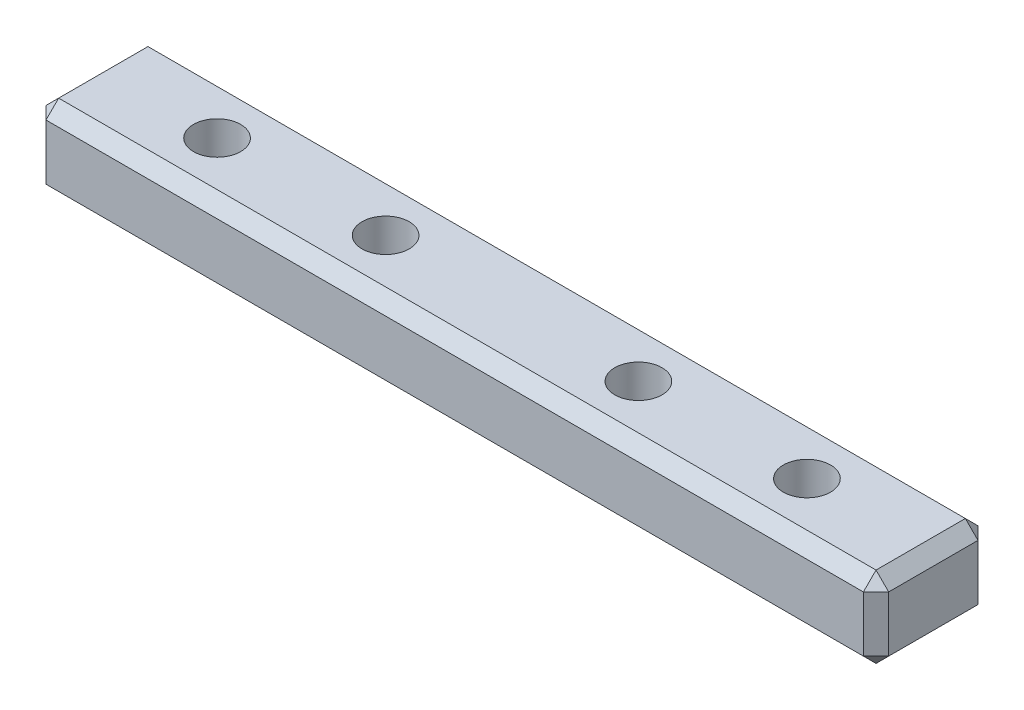
ISO-10303-21;
HEADER;
FILE_DESCRIPTION(('STEP AP214'),'2;1');
FILE_NAME('part.step','',(''),(''),'','','');
FILE_SCHEMA(('AUTOMOTIVE_DESIGN { 1 0 10303 214 1 1 1 1 }'));
ENDSEC;
DATA;
#1=APPLICATION_CONTEXT('core data for automotive mechanical design processes');
#2=APPLICATION_PROTOCOL_DEFINITION('international standard','automotive_design',2000,#1);
#3=PRODUCT_CONTEXT('',#1,'mechanical');
#4=PRODUCT('Part','Part','',(#3));
#5=PRODUCT_RELATED_PRODUCT_CATEGORY('part','',(#4));
#6=PRODUCT_DEFINITION_FORMATION('','',#4);
#7=PRODUCT_DEFINITION_CONTEXT('part definition',#1,'design');
#8=PRODUCT_DEFINITION('design','',#6,#7);
#9=PRODUCT_DEFINITION_SHAPE('','',#8);
#10=(LENGTH_UNIT() NAMED_UNIT(*) SI_UNIT(.MILLI.,.METRE.));
#11=(NAMED_UNIT(*) PLANE_ANGLE_UNIT() SI_UNIT($,.RADIAN.));
#12=(NAMED_UNIT(*) SI_UNIT($,.STERADIAN.) SOLID_ANGLE_UNIT());
#13=UNCERTAINTY_MEASURE_WITH_UNIT(LENGTH_MEASURE(1.E-05),#10,'distance_accuracy_value','');
#14=(GEOMETRIC_REPRESENTATION_CONTEXT(3) GLOBAL_UNCERTAINTY_ASSIGNED_CONTEXT((#13)) GLOBAL_UNIT_ASSIGNED_CONTEXT((#10,
#11,#12)) REPRESENTATION_CONTEXT('',''));
#15=CARTESIAN_POINT('',(0.,0.,0.));
#16=DIRECTION('',(0.,0.,1.));
#17=DIRECTION('',(1.,0.,0.));
#18=AXIS2_PLACEMENT_3D('',#15,#16,#17);
#19=CARTESIAN_POINT('',(0.,4.8,0.));
#20=DIRECTION('',(0.,1.,0.));
#21=DIRECTION('',(0.,0.,1.));
#22=AXIS2_PLACEMENT_3D('',#19,#20,#21);
#23=PLANE('',#22);
#24=DIRECTION('',(0.,0.,-1.));
#25=VECTOR('',#24,1.);
#26=CARTESIAN_POINT('',(48.5,4.8,0.));
#27=LINE('',#26,#25);
#28=CARTESIAN_POINT('',(48.5,4.8,5.3));
#29=VERTEX_POINT('',#28);
#30=CARTESIAN_POINT('',(48.5,4.8,-5.29999999999998));
#31=VERTEX_POINT('',#30);
#32=EDGE_CURVE('E269',#29,#31,#27,.T.);
#33=ORIENTED_EDGE('',*,*,#32,.T.);
#34=DIRECTION('',(-1.,0.,0.));
#35=VECTOR('',#34,1.);
#36=CARTESIAN_POINT('',(0.,4.8,-5.29999999999998));
#37=LINE('',#36,#35);
#38=CARTESIAN_POINT('',(-48.5,4.8,-5.29999999999998));
#39=VERTEX_POINT('',#38);
#40=EDGE_CURVE('E274',#31,#39,#37,.T.);
#41=ORIENTED_EDGE('',*,*,#40,.T.);
#42=DIRECTION('',(0.,0.,1.));
#43=VECTOR('',#42,1.);
#44=CARTESIAN_POINT('',(-48.5,4.8,0.));
#45=LINE('',#44,#43);
#46=CARTESIAN_POINT('',(-48.5,4.8,5.3));
#47=VERTEX_POINT('',#46);
#48=EDGE_CURVE('E271',#39,#47,#45,.T.);
#49=ORIENTED_EDGE('',*,*,#48,.T.);
#50=DIRECTION('',(1.,0.,0.));
#51=VECTOR('',#50,1.);
#52=CARTESIAN_POINT('',(0.,4.8,5.3));
#53=LINE('',#52,#51);
#54=EDGE_CURVE('E267',#47,#29,#53,.T.);
#55=ORIENTED_EDGE('',*,*,#54,.T.);
#56=EDGE_LOOP('',(#33,#41,#49,#55));
#57=FACE_BOUND('',#56,.T.);
#58=CARTESIAN_POINT('',(35.,4.8,0.));
#59=DIRECTION('',(0.,-1.,0.));
#60=DIRECTION('',(0.,0.,-1.));
#61=AXIS2_PLACEMENT_3D('',#58,#59,#60);
#62=CIRCLE('',#61,2.79999999999998);
#63=CARTESIAN_POINT('',(35.,4.8,-2.79999999999998));
#64=VERTEX_POINT('',#63);
#65=EDGE_CURVE('E216',#64,#64,#62,.T.);
#66=ORIENTED_EDGE('',*,*,#65,.T.);
#67=EDGE_LOOP('',(#66));
#68=FACE_BOUND('',#67,.T.);
#69=CARTESIAN_POINT('',(-15.,4.8,0.));
#70=DIRECTION('',(0.,-1.,0.));
#71=DIRECTION('',(0.,0.,-1.));
#72=AXIS2_PLACEMENT_3D('',#69,#70,#71);
#73=CIRCLE('',#72,2.79999999999998);
#74=CARTESIAN_POINT('',(-15.,4.8,-2.79999999999998));
#75=VERTEX_POINT('',#74);
#76=EDGE_CURVE('E152',#75,#75,#73,.T.);
#77=ORIENTED_EDGE('',*,*,#76,.T.);
#78=EDGE_LOOP('',(#77));
#79=FACE_BOUND('',#78,.T.);
#80=CARTESIAN_POINT('',(15.,4.8,0.));
#81=DIRECTION('',(0.,-1.,0.));
#82=DIRECTION('',(0.,0.,-1.));
#83=AXIS2_PLACEMENT_3D('',#80,#81,#82);
#84=CIRCLE('',#83,2.79999999999998);
#85=CARTESIAN_POINT('',(15.,4.8,-2.79999999999998));
#86=VERTEX_POINT('',#85);
#87=EDGE_CURVE('E232',#86,#86,#84,.T.);
#88=ORIENTED_EDGE('',*,*,#87,.T.);
#89=EDGE_LOOP('',(#88));
#90=FACE_BOUND('',#89,.T.);
#91=CARTESIAN_POINT('',(-35.,4.8,0.));
#92=DIRECTION('',(0.,-1.,0.));
#93=DIRECTION('',(0.,0.,-1.));
#94=AXIS2_PLACEMENT_3D('',#91,#92,#93);
#95=CIRCLE('',#94,2.79999999999998);
#96=CARTESIAN_POINT('',(-35.,4.8,-2.79999999999998));
#97=VERTEX_POINT('',#96);
#98=EDGE_CURVE('E226',#97,#97,#95,.T.);
#99=ORIENTED_EDGE('',*,*,#98,.T.);
#100=EDGE_LOOP('',(#99));
#101=FACE_BOUND('',#100,.T.);
#102=ADVANCED_FACE('F38',(#57,#68,#79,#90,#101),#23,.T.);
#103=CARTESIAN_POINT('',(-50.,-4.8,6.8));
#104=DIRECTION('',(0.,0.,1.));
#105=DIRECTION('',(1.,0.,0.));
#106=AXIS2_PLACEMENT_3D('',#103,#104,#105);
#107=PLANE('',#106);
#108=DIRECTION('',(-1.,0.,0.));
#109=VECTOR('',#108,1.);
#110=CARTESIAN_POINT('',(-50.,3.29999999999998,6.8));
#111=LINE('',#110,#109);
#112=CARTESIAN_POINT('',(48.5,3.29999999999998,6.8));
#113=VERTEX_POINT('',#112);
#114=CARTESIAN_POINT('',(-48.5,3.29999999999998,6.8));
#115=VERTEX_POINT('',#114);
#116=EDGE_CURVE('E255',#113,#115,#111,.T.);
#117=ORIENTED_EDGE('',*,*,#116,.T.);
#118=DIRECTION('',(0.,-1.,0.));
#119=VECTOR('',#118,1.);
#120=CARTESIAN_POINT('',(-48.5,-4.8,6.8));
#121=LINE('',#120,#119);
#122=CARTESIAN_POINT('',(-48.5,-3.3,6.8));
#123=VERTEX_POINT('',#122);
#124=EDGE_CURVE('E164',#115,#123,#121,.T.);
#125=ORIENTED_EDGE('',*,*,#124,.T.);
#126=DIRECTION('',(1.,0.,0.));
#127=VECTOR('',#126,1.);
#128=CARTESIAN_POINT('',(50.,-3.3,6.8));
#129=LINE('',#128,#127);
#130=CARTESIAN_POINT('',(48.5,-3.3,6.8));
#131=VERTEX_POINT('',#130);
#132=EDGE_CURVE('E251',#123,#131,#129,.T.);
#133=ORIENTED_EDGE('',*,*,#132,.T.);
#134=DIRECTION('',(0.,1.,0.));
#135=VECTOR('',#134,1.);
#136=CARTESIAN_POINT('',(48.5,-4.8,6.8));
#137=LINE('',#136,#135);
#138=EDGE_CURVE('E253',#131,#113,#137,.T.);
#139=ORIENTED_EDGE('',*,*,#138,.T.);
#140=EDGE_LOOP('',(#117,#125,#133,#139));
#141=FACE_BOUND('',#140,.T.);
#142=ADVANCED_FACE('F320',(#141),#107,.T.);
#143=CARTESIAN_POINT('',(-50.,-4.8,-6.8));
#144=DIRECTION('',(-1.,0.,0.));
#145=DIRECTION('',(0.,0.,1.));
#146=AXIS2_PLACEMENT_3D('',#143,#144,#145);
#147=PLANE('',#146);
#148=DIRECTION('',(0.,-1.,0.));
#149=VECTOR('',#148,1.);
#150=CARTESIAN_POINT('',(-50.,-4.8,-5.29999999999998));
#151=LINE('',#150,#149);
#152=CARTESIAN_POINT('',(-50.,3.29999999999998,-5.29999999999998));
#153=VERTEX_POINT('',#152);
#154=CARTESIAN_POINT('',(-50.,-3.3,-5.29999999999998));
#155=VERTEX_POINT('',#154);
#156=EDGE_CURVE('E140',#153,#155,#151,.T.);
#157=ORIENTED_EDGE('',*,*,#156,.T.);
#158=DIRECTION('',(0.,0.,1.));
#159=VECTOR('',#158,1.);
#160=CARTESIAN_POINT('',(-50.,-3.3,6.8));
#161=LINE('',#160,#159);
#162=CARTESIAN_POINT('',(-50.,-3.3,5.3));
#163=VERTEX_POINT('',#162);
#164=EDGE_CURVE('E136',#155,#163,#161,.T.);
#165=ORIENTED_EDGE('',*,*,#164,.T.);
#166=DIRECTION('',(0.,1.,0.));
#167=VECTOR('',#166,1.);
#168=CARTESIAN_POINT('',(-50.,-4.8,5.3));
#169=LINE('',#168,#167);
#170=CARTESIAN_POINT('',(-50.,3.29999999999998,5.3));
#171=VERTEX_POINT('',#170);
#172=EDGE_CURVE('E130',#163,#171,#169,.T.);
#173=ORIENTED_EDGE('',*,*,#172,.T.);
#174=DIRECTION('',(0.,0.,-1.));
#175=VECTOR('',#174,1.);
#176=CARTESIAN_POINT('',(-50.,3.29999999999998,-6.8));
#177=LINE('',#176,#175);
#178=EDGE_CURVE('E133',#171,#153,#177,.T.);
#179=ORIENTED_EDGE('',*,*,#178,.T.);
#180=EDGE_LOOP('',(#157,#165,#173,#179));
#181=FACE_BOUND('',#180,.T.);
#182=ADVANCED_FACE('F132',(#181),#147,.T.);
#183=CARTESIAN_POINT('',(50.,-4.8,-6.8));
#184=DIRECTION('',(0.,0.,-1.));
#185=DIRECTION('',(-1.,0.,0.));
#186=AXIS2_PLACEMENT_3D('',#183,#184,#185);
#187=PLANE('',#186);
#188=DIRECTION('',(-1.,0.,0.));
#189=VECTOR('',#188,1.);
#190=CARTESIAN_POINT('',(-50.,-3.3,-6.8));
#191=LINE('',#190,#189);
#192=CARTESIAN_POINT('',(48.5,-3.3,-6.8));
#193=VERTEX_POINT('',#192);
#194=CARTESIAN_POINT('',(-48.5,-3.3,-6.8));
#195=VERTEX_POINT('',#194);
#196=EDGE_CURVE('E258',#193,#195,#191,.T.);
#197=ORIENTED_EDGE('',*,*,#196,.T.);
#198=DIRECTION('',(0.,1.,0.));
#199=VECTOR('',#198,1.);
#200=CARTESIAN_POINT('',(-48.5,-4.8,-6.8));
#201=LINE('',#200,#199);
#202=CARTESIAN_POINT('',(-48.5,3.3,-6.8));
#203=VERTEX_POINT('',#202);
#204=EDGE_CURVE('E264',#195,#203,#201,.T.);
#205=ORIENTED_EDGE('',*,*,#204,.T.);
#206=DIRECTION('',(1.,0.,0.));
#207=VECTOR('',#206,1.);
#208=CARTESIAN_POINT('',(50.,3.3,-6.8));
#209=LINE('',#208,#207);
#210=CARTESIAN_POINT('',(48.5,3.3,-6.8));
#211=VERTEX_POINT('',#210);
#212=EDGE_CURVE('E262',#203,#211,#209,.T.);
#213=ORIENTED_EDGE('',*,*,#212,.T.);
#214=DIRECTION('',(0.,-1.,0.));
#215=VECTOR('',#214,1.);
#216=CARTESIAN_POINT('',(48.5,-4.8,-6.8));
#217=LINE('',#216,#215);
#218=EDGE_CURVE('E260',#211,#193,#217,.T.);
#219=ORIENTED_EDGE('',*,*,#218,.T.);
#220=EDGE_LOOP('',(#197,#205,#213,#219));
#221=FACE_BOUND('',#220,.T.);
#222=ADVANCED_FACE('F339',(#221),#187,.T.);
#223=CARTESIAN_POINT('',(50.,-4.8,6.8));
#224=DIRECTION('',(1.,0.,0.));
#225=DIRECTION('',(0.,0.,-1.));
#226=AXIS2_PLACEMENT_3D('',#223,#224,#225);
#227=PLANE('',#226);
#228=DIRECTION('',(0.,1.,0.));
#229=VECTOR('',#228,1.);
#230=CARTESIAN_POINT('',(50.,-4.8,-5.29999999999998));
#231=LINE('',#230,#229);
#232=CARTESIAN_POINT('',(50.,-3.3,-5.29999999999998));
#233=VERTEX_POINT('',#232);
#234=CARTESIAN_POINT('',(50.,3.29999999999998,-5.29999999999998));
#235=VERTEX_POINT('',#234);
#236=EDGE_CURVE('E48',#233,#235,#231,.T.);
#237=ORIENTED_EDGE('',*,*,#236,.T.);
#238=DIRECTION('',(0.,0.,1.));
#239=VECTOR('',#238,1.);
#240=CARTESIAN_POINT('',(50.,3.29999999999998,6.8));
#241=LINE('',#240,#239);
#242=CARTESIAN_POINT('',(50.,3.29999999999998,5.29999999999998));
#243=VERTEX_POINT('',#242);
#244=EDGE_CURVE('E11',#235,#243,#241,.T.);
#245=ORIENTED_EDGE('',*,*,#244,.T.);
#246=DIRECTION('',(0.,-1.,0.));
#247=VECTOR('',#246,1.);
#248=CARTESIAN_POINT('',(50.,-4.8,5.29999999999998));
#249=LINE('',#248,#247);
#250=CARTESIAN_POINT('',(50.,-3.3,5.29999999999998));
#251=VERTEX_POINT('',#250);
#252=EDGE_CURVE('E62',#243,#251,#249,.T.);
#253=ORIENTED_EDGE('',*,*,#252,.T.);
#254=DIRECTION('',(0.,0.,-1.));
#255=VECTOR('',#254,1.);
#256=CARTESIAN_POINT('',(50.,-3.3,-6.8));
#257=LINE('',#256,#255);
#258=EDGE_CURVE('E276',#251,#233,#257,.T.);
#259=ORIENTED_EDGE('',*,*,#258,.T.);
#260=EDGE_LOOP('',(#237,#245,#253,#259));
#261=FACE_BOUND('',#260,.T.);
#262=ADVANCED_FACE('F377',(#261),#227,.T.);
#263=CARTESIAN_POINT('',(0.,-4.8,0.));
#264=DIRECTION('',(0.,1.,0.));
#265=DIRECTION('',(0.,0.,1.));
#266=AXIS2_PLACEMENT_3D('',#263,#264,#265);
#267=PLANE('',#266);
#268=DIRECTION('',(-1.,0.,0.));
#269=VECTOR('',#268,1.);
#270=CARTESIAN_POINT('',(-50.,-4.8,5.29999999999998));
#271=LINE('',#270,#269);
#272=CARTESIAN_POINT('',(48.5,-4.8,5.29999999999998));
#273=VERTEX_POINT('',#272);
#274=CARTESIAN_POINT('',(-48.5,-4.8,5.29999999999998));
#275=VERTEX_POINT('',#274);
#276=EDGE_CURVE('E246',#273,#275,#271,.T.);
#277=ORIENTED_EDGE('',*,*,#276,.T.);
#278=DIRECTION('',(0.,0.,-1.));
#279=VECTOR('',#278,1.);
#280=CARTESIAN_POINT('',(-48.5,-4.8,-6.8));
#281=LINE('',#280,#279);
#282=CARTESIAN_POINT('',(-48.5,-4.8,-5.29999999999998));
#283=VERTEX_POINT('',#282);
#284=EDGE_CURVE('E248',#275,#283,#281,.T.);
#285=ORIENTED_EDGE('',*,*,#284,.T.);
#286=DIRECTION('',(1.,0.,0.));
#287=VECTOR('',#286,1.);
#288=CARTESIAN_POINT('',(50.,-4.8,-5.29999999999998));
#289=LINE('',#288,#287);
#290=CARTESIAN_POINT('',(48.5,-4.8,-5.29999999999998));
#291=VERTEX_POINT('',#290);
#292=EDGE_CURVE('E242',#283,#291,#289,.T.);
#293=ORIENTED_EDGE('',*,*,#292,.T.);
#294=DIRECTION('',(0.,0.,1.));
#295=VECTOR('',#294,1.);
#296=CARTESIAN_POINT('',(48.5,-4.8,6.8));
#297=LINE('',#296,#295);
#298=EDGE_CURVE('E244',#291,#273,#297,.T.);
#299=ORIENTED_EDGE('',*,*,#298,.T.);
#300=EDGE_LOOP('',(#277,#285,#293,#299));
#301=FACE_BOUND('',#300,.T.);
#302=CARTESIAN_POINT('',(35.,-4.8,0.));
#303=DIRECTION('',(0.,-1.,0.));
#304=DIRECTION('',(0.,0.,-1.));
#305=AXIS2_PLACEMENT_3D('',#302,#303,#304);
#306=CIRCLE('',#305,2.79999999999998);
#307=CARTESIAN_POINT('',(35.,-4.8,-2.79999999999998));
#308=VERTEX_POINT('',#307);
#309=EDGE_CURVE('E210',#308,#308,#306,.T.);
#310=ORIENTED_EDGE('',*,*,#309,.F.);
#311=EDGE_LOOP('',(#310));
#312=FACE_BOUND('',#311,.T.);
#313=CARTESIAN_POINT('',(-35.,-4.8,0.));
#314=DIRECTION('',(0.,-1.,0.));
#315=DIRECTION('',(0.,0.,-1.));
#316=AXIS2_PLACEMENT_3D('',#313,#314,#315);
#317=CIRCLE('',#316,2.79999999999998);
#318=CARTESIAN_POINT('',(-35.,-4.8,-2.79999999999998));
#319=VERTEX_POINT('',#318);
#320=EDGE_CURVE('E221',#319,#319,#317,.T.);
#321=ORIENTED_EDGE('',*,*,#320,.F.);
#322=EDGE_LOOP('',(#321));
#323=FACE_BOUND('',#322,.T.);
#324=CARTESIAN_POINT('',(15.,-4.8,0.));
#325=DIRECTION('',(0.,-1.,0.));
#326=DIRECTION('',(0.,0.,-1.));
#327=AXIS2_PLACEMENT_3D('',#324,#325,#326);
#328=CIRCLE('',#327,2.79999999999998);
#329=CARTESIAN_POINT('',(15.,-4.8,-2.79999999999998));
#330=VERTEX_POINT('',#329);
#331=EDGE_CURVE('E229',#330,#330,#328,.T.);
#332=ORIENTED_EDGE('',*,*,#331,.F.);
#333=EDGE_LOOP('',(#332));
#334=FACE_BOUND('',#333,.T.);
#335=CARTESIAN_POINT('',(-15.,-4.8,0.));
#336=DIRECTION('',(0.,-1.,0.));
#337=DIRECTION('',(0.,0.,-1.));
#338=AXIS2_PLACEMENT_3D('',#335,#336,#337);
#339=CIRCLE('',#338,2.79999999999998);
#340=CARTESIAN_POINT('',(-15.,-4.8,-2.79999999999999));
#341=VERTEX_POINT('',#340);
#342=EDGE_CURVE('E235',#341,#341,#339,.T.);
#343=ORIENTED_EDGE('',*,*,#342,.F.);
#344=EDGE_LOOP('',(#343));
#345=FACE_BOUND('',#344,.T.);
#346=ADVANCED_FACE('F305',(#301,#312,#323,#334,#345),#267,.F.);
#347=CARTESIAN_POINT('',(-15.,-4.8,0.));
#348=DIRECTION('',(0.,-1.,0.));
#349=DIRECTION('',(0.,0.,-1.));
#350=AXIS2_PLACEMENT_3D('',#347,#348,#349);
#351=CYLINDRICAL_SURFACE('',#350,2.79999999999998);
#352=ORIENTED_EDGE('',*,*,#76,.F.);
#353=EDGE_LOOP('',(#352));
#354=FACE_BOUND('',#353,.T.);
#355=ORIENTED_EDGE('',*,*,#342,.T.);
#356=EDGE_LOOP('',(#355));
#357=FACE_BOUND('',#356,.T.);
#358=ADVANCED_FACE('F658',(#354,#357),#351,.F.);
#359=CARTESIAN_POINT('',(15.,-4.8,0.));
#360=DIRECTION('',(0.,-1.,0.));
#361=DIRECTION('',(0.,0.,-1.));
#362=AXIS2_PLACEMENT_3D('',#359,#360,#361);
#363=CYLINDRICAL_SURFACE('',#362,2.79999999999998);
#364=ORIENTED_EDGE('',*,*,#87,.F.);
#365=EDGE_LOOP('',(#364));
#366=FACE_BOUND('',#365,.T.);
#367=ORIENTED_EDGE('',*,*,#331,.T.);
#368=EDGE_LOOP('',(#367));
#369=FACE_BOUND('',#368,.T.);
#370=ADVANCED_FACE('F647',(#366,#369),#363,.F.);
#371=CARTESIAN_POINT('',(-35.,-4.8,0.));
#372=DIRECTION('',(0.,-1.,0.));
#373=DIRECTION('',(0.,0.,-1.));
#374=AXIS2_PLACEMENT_3D('',#371,#372,#373);
#375=CYLINDRICAL_SURFACE('',#374,2.79999999999998);
#376=ORIENTED_EDGE('',*,*,#98,.F.);
#377=EDGE_LOOP('',(#376));
#378=FACE_BOUND('',#377,.T.);
#379=ORIENTED_EDGE('',*,*,#320,.T.);
#380=EDGE_LOOP('',(#379));
#381=FACE_BOUND('',#380,.T.);
#382=ADVANCED_FACE('F636',(#378,#381),#375,.F.);
#383=CARTESIAN_POINT('',(35.,-4.8,0.));
#384=DIRECTION('',(0.,-1.,0.));
#385=DIRECTION('',(0.,0.,-1.));
#386=AXIS2_PLACEMENT_3D('',#383,#384,#385);
#387=CYLINDRICAL_SURFACE('',#386,2.79999999999998);
#388=ORIENTED_EDGE('',*,*,#65,.F.);
#389=EDGE_LOOP('',(#388));
#390=FACE_BOUND('',#389,.T.);
#391=ORIENTED_EDGE('',*,*,#309,.T.);
#392=EDGE_LOOP('',(#391));
#393=FACE_BOUND('',#392,.T.);
#394=ADVANCED_FACE('F625',(#390,#393),#387,.F.);
#395=CARTESIAN_POINT('',(48.5,4.8,0.));
#396=DIRECTION('',(-0.707106781186551,-0.707106781186544,0.));
#397=DIRECTION('',(0.,0.,-1.));
#398=AXIS2_PLACEMENT_3D('',#395,#396,#397);
#399=PLANE('',#398);
#400=DIRECTION('',(-0.707106781186544,0.707106781186551,0.));
#401=VECTOR('',#400,1.);
#402=CARTESIAN_POINT('',(48.5,4.8,-5.29999999999998));
#403=LINE('',#402,#401);
#404=EDGE_CURVE('E43',#31,#235,#403,.F.);
#405=ORIENTED_EDGE('',*,*,#404,.F.);
#406=ORIENTED_EDGE('',*,*,#32,.F.);
#407=DIRECTION('',(0.707106781186544,-0.707106781186551,0.));
#408=VECTOR('',#407,1.);
#409=CARTESIAN_POINT('',(50.,3.29999999999998,5.29999999999998));
#410=LINE('',#409,#408);
#411=EDGE_CURVE('E204',#243,#29,#410,.F.);
#412=ORIENTED_EDGE('',*,*,#411,.F.);
#413=ORIENTED_EDGE('',*,*,#244,.F.);
#414=EDGE_LOOP('',(#405,#406,#412,#413));
#415=FACE_BOUND('',#414,.T.);
#416=ADVANCED_FACE('F41',(#415),#399,.F.);
#417=CARTESIAN_POINT('',(48.5,4.8,-5.29999999999998));
#418=DIRECTION('',(0.577350269189631,0.577350269189626,-0.57735026918962));
#419=DIRECTION('',(-0.707106781186544,0.707106781186551,0.));
#420=AXIS2_PLACEMENT_3D('',#417,#418,#419);
#421=PLANE('',#420);
#422=DIRECTION('',(0.,-0.707106781186544,-0.707106781186551));
#423=VECTOR('',#422,1.);
#424=CARTESIAN_POINT('',(48.5,4.8,-5.29999999999998));
#425=LINE('',#424,#423);
#426=EDGE_CURVE('E199',#31,#211,#425,.T.);
#427=ORIENTED_EDGE('',*,*,#426,.F.);
#428=ORIENTED_EDGE('',*,*,#404,.T.);
#429=DIRECTION('',(0.707106781186544,0.,0.707106781186551));
#430=VECTOR('',#429,1.);
#431=CARTESIAN_POINT('',(49.25,3.29999999999999,-6.04999999999999));
#432=LINE('',#431,#430);
#433=EDGE_CURVE('E202',#211,#235,#432,.T.);
#434=ORIENTED_EDGE('',*,*,#433,.F.);
#435=EDGE_LOOP('',(#427,#428,#434));
#436=FACE_BOUND('',#435,.T.);
#437=ADVANCED_FACE('F356',(#436),#421,.T.);
#438=CARTESIAN_POINT('',(50.,3.29999999999998,5.29999999999998));
#439=DIRECTION('',(0.577350269189631,0.57735026918962,0.577350269189626));
#440=DIRECTION('',(0.707106781186544,0.,-0.707106781186551));
#441=AXIS2_PLACEMENT_3D('',#438,#439,#440);
#442=PLANE('',#441);
#443=DIRECTION('',(-0.707106781186544,0.,0.707106781186551));
#444=VECTOR('',#443,1.);
#445=CARTESIAN_POINT('',(50.,3.29999999999998,5.29999999999998));
#446=LINE('',#445,#444);
#447=EDGE_CURVE('E194',#243,#113,#446,.T.);
#448=ORIENTED_EDGE('',*,*,#447,.F.);
#449=ORIENTED_EDGE('',*,*,#411,.T.);
#450=DIRECTION('',(0.,0.707106781186551,-0.707106781186544));
#451=VECTOR('',#450,1.);
#452=CARTESIAN_POINT('',(48.5,4.04999999999999,6.05));
#453=LINE('',#452,#451);
#454=EDGE_CURVE('E196',#113,#29,#453,.T.);
#455=ORIENTED_EDGE('',*,*,#454,.F.);
#456=EDGE_LOOP('',(#448,#449,#455));
#457=FACE_BOUND('',#456,.T.);
#458=ADVANCED_FACE('F354',(#457),#442,.T.);
#459=CARTESIAN_POINT('',(50.,-4.8,-5.29999999999998));
#460=DIRECTION('',(-0.707106781186551,0.,0.707106781186544));
#461=DIRECTION('',(0.,1.,0.));
#462=AXIS2_PLACEMENT_3D('',#459,#460,#461);
#463=PLANE('',#462);
#464=ORIENTED_EDGE('',*,*,#433,.T.);
#465=ORIENTED_EDGE('',*,*,#236,.F.);
#466=DIRECTION('',(-0.707106781186544,0.,-0.707106781186551));
#467=VECTOR('',#466,1.);
#468=CARTESIAN_POINT('',(48.5,-3.3,-6.8));
#469=LINE('',#468,#467);
#470=EDGE_CURVE('E188',#193,#233,#469,.F.);
#471=ORIENTED_EDGE('',*,*,#470,.F.);
#472=ORIENTED_EDGE('',*,*,#218,.F.);
#473=EDGE_LOOP('',(#464,#465,#471,#472));
#474=FACE_BOUND('',#473,.T.);
#475=ADVANCED_FACE('F343',(#474),#463,.F.);
#476=CARTESIAN_POINT('',(0.,4.8,-5.29999999999998));
#477=DIRECTION('',(0.,-0.707106781186551,0.707106781186544));
#478=DIRECTION('',(-1.,0.,0.));
#479=AXIS2_PLACEMENT_3D('',#476,#477,#478);
#480=PLANE('',#479);
#481=ORIENTED_EDGE('',*,*,#426,.T.);
#482=ORIENTED_EDGE('',*,*,#212,.F.);
#483=DIRECTION('',(0.,0.707106781186544,0.707106781186551));
#484=VECTOR('',#483,1.);
#485=CARTESIAN_POINT('',(-48.5,3.3,-6.8));
#486=LINE('',#485,#484);
#487=EDGE_CURVE('E185',#39,#203,#486,.F.);
#488=ORIENTED_EDGE('',*,*,#487,.F.);
#489=ORIENTED_EDGE('',*,*,#40,.F.);
#490=EDGE_LOOP('',(#481,#482,#488,#489));
#491=FACE_BOUND('',#490,.T.);
#492=ADVANCED_FACE('F331',(#491),#480,.F.);
#493=CARTESIAN_POINT('',(-48.5,4.8,0.));
#494=DIRECTION('',(0.707106781186551,-0.707106781186544,0.));
#495=DIRECTION('',(0.,0.,1.));
#496=AXIS2_PLACEMENT_3D('',#493,#494,#495);
#497=PLANE('',#496);
#498=DIRECTION('',(0.707106781186544,0.707106781186551,0.));
#499=VECTOR('',#498,1.);
#500=CARTESIAN_POINT('',(-50.,3.29999999999998,5.3));
#501=LINE('',#500,#499);
#502=EDGE_CURVE('E147',#47,#171,#501,.F.);
#503=ORIENTED_EDGE('',*,*,#502,.F.);
#504=ORIENTED_EDGE('',*,*,#48,.F.);
#505=DIRECTION('',(-0.707106781186544,-0.707106781186551,0.));
#506=VECTOR('',#505,1.);
#507=CARTESIAN_POINT('',(-49.25,4.04999999999999,-5.29999999999998));
#508=LINE('',#507,#506);
#509=EDGE_CURVE('E150',#153,#39,#508,.F.);
#510=ORIENTED_EDGE('',*,*,#509,.F.);
#511=ORIENTED_EDGE('',*,*,#178,.F.);
#512=EDGE_LOOP('',(#503,#504,#510,#511));
#513=FACE_BOUND('',#512,.T.);
#514=ADVANCED_FACE('F145',(#513),#497,.F.);
#515=CARTESIAN_POINT('',(0.,4.8,5.3));
#516=DIRECTION('',(0.,-0.707106781186544,-0.707106781186551));
#517=DIRECTION('',(1.,0.,0.));
#518=AXIS2_PLACEMENT_3D('',#515,#516,#517);
#519=PLANE('',#518);
#520=ORIENTED_EDGE('',*,*,#454,.T.);
#521=ORIENTED_EDGE('',*,*,#54,.F.);
#522=DIRECTION('',(0.,-0.707106781186551,0.707106781186544));
#523=VECTOR('',#522,1.);
#524=CARTESIAN_POINT('',(-48.5,4.04999999999999,6.05));
#525=LINE('',#524,#523);
#526=EDGE_CURVE('E160',#115,#47,#525,.F.);
#527=ORIENTED_EDGE('',*,*,#526,.F.);
#528=ORIENTED_EDGE('',*,*,#116,.F.);
#529=EDGE_LOOP('',(#520,#521,#527,#528));
#530=FACE_BOUND('',#529,.T.);
#531=ADVANCED_FACE('F323',(#530),#519,.F.);
#532=CARTESIAN_POINT('',(48.5,-4.8,6.8));
#533=DIRECTION('',(-0.707106781186551,0.,-0.707106781186544));
#534=DIRECTION('',(0.,1.,0.));
#535=AXIS2_PLACEMENT_3D('',#532,#533,#534);
#536=PLANE('',#535);
#537=ORIENTED_EDGE('',*,*,#447,.T.);
#538=ORIENTED_EDGE('',*,*,#138,.F.);
#539=DIRECTION('',(0.707106781186544,0.,-0.707106781186551));
#540=VECTOR('',#539,1.);
#541=CARTESIAN_POINT('',(50.,-3.3,5.29999999999998));
#542=LINE('',#541,#540);
#543=EDGE_CURVE('E180',#251,#131,#542,.F.);
#544=ORIENTED_EDGE('',*,*,#543,.F.);
#545=ORIENTED_EDGE('',*,*,#252,.F.);
#546=EDGE_LOOP('',(#537,#538,#544,#545));
#547=FACE_BOUND('',#546,.T.);
#548=ADVANCED_FACE('F353',(#547),#536,.F.);
#549=CARTESIAN_POINT('',(50.,-3.3,6.8));
#550=DIRECTION('',(0.707106781186544,-0.707106781186551,0.));
#551=DIRECTION('',(0.,0.,1.));
#552=AXIS2_PLACEMENT_3D('',#549,#550,#551);
#553=PLANE('',#552);
#554=DIRECTION('',(-0.707106781186551,-0.707106781186544,0.));
#555=VECTOR('',#554,1.);
#556=CARTESIAN_POINT('',(49.25,-4.05,-5.29999999999999));
#557=LINE('',#556,#555);
#558=EDGE_CURVE('E191',#233,#291,#557,.T.);
#559=ORIENTED_EDGE('',*,*,#558,.F.);
#560=ORIENTED_EDGE('',*,*,#258,.F.);
#561=DIRECTION('',(0.707106781186551,0.707106781186544,0.));
#562=VECTOR('',#561,1.);
#563=CARTESIAN_POINT('',(50.,-3.3,5.29999999999998));
#564=LINE('',#563,#562);
#565=EDGE_CURVE('E177',#273,#251,#564,.T.);
#566=ORIENTED_EDGE('',*,*,#565,.F.);
#567=ORIENTED_EDGE('',*,*,#298,.F.);
#568=EDGE_LOOP('',(#559,#560,#566,#567));
#569=FACE_BOUND('',#568,.T.);
#570=ADVANCED_FACE('F349',(#569),#553,.T.);
#571=CARTESIAN_POINT('',(48.5,-3.3,-6.8));
#572=DIRECTION('',(0.577350269189626,-0.577350269189631,-0.57735026918962));
#573=DIRECTION('',(0.707106781186551,0.707106781186544,0.));
#574=AXIS2_PLACEMENT_3D('',#571,#572,#573);
#575=PLANE('',#574);
#576=ORIENTED_EDGE('',*,*,#470,.T.);
#577=ORIENTED_EDGE('',*,*,#558,.T.);
#578=DIRECTION('',(0.,0.707106781186544,-0.707106781186551));
#579=VECTOR('',#578,1.);
#580=CARTESIAN_POINT('',(48.5,-3.3,-6.8));
#581=LINE('',#580,#579);
#582=EDGE_CURVE('E168',#193,#291,#581,.F.);
#583=ORIENTED_EDGE('',*,*,#582,.F.);
#584=EDGE_LOOP('',(#576,#577,#583));
#585=FACE_BOUND('',#584,.T.);
#586=ADVANCED_FACE('F346',(#585),#575,.T.);
#587=CARTESIAN_POINT('',(-48.5,3.3,-6.8));
#588=DIRECTION('',(-0.577350269189631,0.577350269189626,-0.57735026918962));
#589=DIRECTION('',(-0.707106781186544,-0.707106781186551,0.));
#590=AXIS2_PLACEMENT_3D('',#587,#588,#589);
#591=PLANE('',#590);
#592=ORIENTED_EDGE('',*,*,#509,.T.);
#593=ORIENTED_EDGE('',*,*,#487,.T.);
#594=DIRECTION('',(0.707106781186544,0.,-0.707106781186551));
#595=VECTOR('',#594,1.);
#596=CARTESIAN_POINT('',(-48.5,3.3,-6.8));
#597=LINE('',#596,#595);
#598=EDGE_CURVE('E165',#153,#203,#597,.T.);
#599=ORIENTED_EDGE('',*,*,#598,.F.);
#600=EDGE_LOOP('',(#592,#593,#599));
#601=FACE_BOUND('',#600,.T.);
#602=ADVANCED_FACE('F333',(#601),#591,.T.);
#603=CARTESIAN_POINT('',(-50.,3.29999999999998,5.3));
#604=DIRECTION('',(-0.577350269189626,0.57735026918962,0.577350269189631));
#605=DIRECTION('',(0.707106781186551,0.,0.707106781186544));
#606=AXIS2_PLACEMENT_3D('',#603,#604,#605);
#607=PLANE('',#606);
#608=ORIENTED_EDGE('',*,*,#526,.T.);
#609=ORIENTED_EDGE('',*,*,#502,.T.);
#610=DIRECTION('',(-0.707106781186551,0.,-0.707106781186544));
#611=VECTOR('',#610,1.);
#612=CARTESIAN_POINT('',(-50.,3.29999999999998,5.3));
#613=LINE('',#612,#611);
#614=EDGE_CURVE('E157',#115,#171,#613,.T.);
#615=ORIENTED_EDGE('',*,*,#614,.F.);
#616=EDGE_LOOP('',(#608,#609,#615));
#617=FACE_BOUND('',#616,.T.);
#618=ADVANCED_FACE('F156',(#617),#607,.T.);
#619=CARTESIAN_POINT('',(50.,-3.3,5.29999999999998));
#620=DIRECTION('',(0.577350269189626,-0.577350269189631,0.57735026918962));
#621=DIRECTION('',(0.707106781186551,0.707106781186544,0.));
#622=AXIS2_PLACEMENT_3D('',#619,#620,#621);
#623=PLANE('',#622);
#624=ORIENTED_EDGE('',*,*,#565,.T.);
#625=ORIENTED_EDGE('',*,*,#543,.T.);
#626=DIRECTION('',(0.,-0.707106781186544,-0.707106781186551));
#627=VECTOR('',#626,1.);
#628=CARTESIAN_POINT('',(48.5,-4.05,6.04999999999999));
#629=LINE('',#628,#627);
#630=EDGE_CURVE('E166',#273,#131,#629,.F.);
#631=ORIENTED_EDGE('',*,*,#630,.F.);
#632=EDGE_LOOP('',(#624,#625,#631));
#633=FACE_BOUND('',#632,.T.);
#634=ADVANCED_FACE('F352',(#633),#623,.T.);
#635=CARTESIAN_POINT('',(50.,-3.3,-6.8));
#636=DIRECTION('',(0.,-0.707106781186551,-0.707106781186544));
#637=DIRECTION('',(1.,0.,0.));
#638=AXIS2_PLACEMENT_3D('',#635,#636,#637);
#639=PLANE('',#638);
#640=ORIENTED_EDGE('',*,*,#582,.T.);
#641=ORIENTED_EDGE('',*,*,#292,.F.);
#642=DIRECTION('',(0.,-0.707106781186544,0.707106781186551));
#643=VECTOR('',#642,1.);
#644=CARTESIAN_POINT('',(-48.5,-4.8,-5.29999999999998));
#645=LINE('',#644,#643);
#646=EDGE_CURVE('E171',#195,#283,#645,.T.);
#647=ORIENTED_EDGE('',*,*,#646,.F.);
#648=ORIENTED_EDGE('',*,*,#196,.F.);
#649=EDGE_LOOP('',(#640,#641,#647,#648));
#650=FACE_BOUND('',#649,.T.);
#651=ADVANCED_FACE('F300',(#650),#639,.T.);
#652=CARTESIAN_POINT('',(-48.5,-4.8,-6.8));
#653=DIRECTION('',(0.707106781186551,0.,0.707106781186544));
#654=DIRECTION('',(0.,1.,0.));
#655=AXIS2_PLACEMENT_3D('',#652,#653,#654);
#656=PLANE('',#655);
#657=ORIENTED_EDGE('',*,*,#598,.T.);
#658=ORIENTED_EDGE('',*,*,#204,.F.);
#659=DIRECTION('',(-0.707106781186544,0.,0.707106781186551));
#660=VECTOR('',#659,1.);
#661=CARTESIAN_POINT('',(-49.25,-3.3,-6.04999999999999));
#662=LINE('',#661,#660);
#663=EDGE_CURVE('E289',#155,#195,#662,.F.);
#664=ORIENTED_EDGE('',*,*,#663,.F.);
#665=ORIENTED_EDGE('',*,*,#156,.F.);
#666=EDGE_LOOP('',(#657,#658,#664,#665));
#667=FACE_BOUND('',#666,.T.);
#668=ADVANCED_FACE('F337',(#667),#656,.F.);
#669=CARTESIAN_POINT('',(-50.,-4.8,5.3));
#670=DIRECTION('',(0.707106781186544,0.,-0.707106781186551));
#671=DIRECTION('',(0.,1.,0.));
#672=AXIS2_PLACEMENT_3D('',#669,#670,#671);
#673=PLANE('',#672);
#674=ORIENTED_EDGE('',*,*,#614,.T.);
#675=ORIENTED_EDGE('',*,*,#172,.F.);
#676=DIRECTION('',(0.707106781186551,0.,0.707106781186544));
#677=VECTOR('',#676,1.);
#678=CARTESIAN_POINT('',(-50.,-3.3,5.3));
#679=LINE('',#678,#677);
#680=EDGE_CURVE('E286',#123,#163,#679,.F.);
#681=ORIENTED_EDGE('',*,*,#680,.F.);
#682=ORIENTED_EDGE('',*,*,#124,.F.);
#683=EDGE_LOOP('',(#674,#675,#681,#682));
#684=FACE_BOUND('',#683,.T.);
#685=ADVANCED_FACE('F162',(#684),#673,.F.);
#686=CARTESIAN_POINT('',(-50.,-3.3,6.8));
#687=DIRECTION('',(0.,-0.707106781186551,0.707106781186544));
#688=DIRECTION('',(-1.,0.,0.));
#689=AXIS2_PLACEMENT_3D('',#686,#687,#688);
#690=PLANE('',#689);
#691=ORIENTED_EDGE('',*,*,#630,.T.);
#692=ORIENTED_EDGE('',*,*,#132,.F.);
#693=DIRECTION('',(0.,0.707106781186544,0.707106781186551));
#694=VECTOR('',#693,1.);
#695=CARTESIAN_POINT('',(-48.5,-4.05,6.04999999999999));
#696=LINE('',#695,#694);
#697=EDGE_CURVE('E284',#275,#123,#696,.T.);
#698=ORIENTED_EDGE('',*,*,#697,.F.);
#699=ORIENTED_EDGE('',*,*,#276,.F.);
#700=EDGE_LOOP('',(#691,#692,#698,#699));
#701=FACE_BOUND('',#700,.T.);
#702=ADVANCED_FACE('F316',(#701),#690,.T.);
#703=CARTESIAN_POINT('',(-48.5,-4.8,-5.29999999999998));
#704=DIRECTION('',(-0.577350269189626,-0.577350269189631,-0.57735026918962));
#705=DIRECTION('',(0.707106781186551,-0.707106781186544,0.));
#706=AXIS2_PLACEMENT_3D('',#703,#704,#705);
#707=PLANE('',#706);
#708=ORIENTED_EDGE('',*,*,#663,.T.);
#709=ORIENTED_EDGE('',*,*,#646,.T.);
#710=DIRECTION('',(-0.707106781186551,0.707106781186544,0.));
#711=VECTOR('',#710,1.);
#712=CARTESIAN_POINT('',(-48.5,-4.8,-5.29999999999998));
#713=LINE('',#712,#711);
#714=EDGE_CURVE('E282',#155,#283,#713,.F.);
#715=ORIENTED_EDGE('',*,*,#714,.F.);
#716=EDGE_LOOP('',(#708,#709,#715));
#717=FACE_BOUND('',#716,.T.);
#718=ADVANCED_FACE('F296',(#717),#707,.T.);
#719=CARTESIAN_POINT('',(-50.,-3.3,5.3));
#720=DIRECTION('',(-0.57735026918962,-0.577350269189631,0.577350269189626));
#721=DIRECTION('',(0.,-0.707106781186544,-0.707106781186551));
#722=AXIS2_PLACEMENT_3D('',#719,#720,#721);
#723=PLANE('',#722);
#724=ORIENTED_EDGE('',*,*,#697,.T.);
#725=ORIENTED_EDGE('',*,*,#680,.T.);
#726=DIRECTION('',(0.707106781186551,-0.707106781186544,0.));
#727=VECTOR('',#726,1.);
#728=CARTESIAN_POINT('',(-50.,-3.3,5.3));
#729=LINE('',#728,#727);
#730=EDGE_CURVE('E280',#275,#163,#729,.F.);
#731=ORIENTED_EDGE('',*,*,#730,.F.);
#732=EDGE_LOOP('',(#724,#725,#731));
#733=FACE_BOUND('',#732,.T.);
#734=ADVANCED_FACE('F313',(#733),#723,.T.);
#735=CARTESIAN_POINT('',(-50.,-3.3,-6.8));
#736=DIRECTION('',(-0.707106781186544,-0.707106781186551,0.));
#737=DIRECTION('',(0.,0.,-1.));
#738=AXIS2_PLACEMENT_3D('',#735,#736,#737);
#739=PLANE('',#738);
#740=ORIENTED_EDGE('',*,*,#714,.T.);
#741=ORIENTED_EDGE('',*,*,#284,.F.);
#742=ORIENTED_EDGE('',*,*,#730,.T.);
#743=ORIENTED_EDGE('',*,*,#164,.F.);
#744=EDGE_LOOP('',(#740,#741,#742,#743));
#745=FACE_BOUND('',#744,.T.);
#746=ADVANCED_FACE('F311',(#745),#739,.T.);
#747=CLOSED_SHELL('',(#102,#142,#182,#222,#262,#346,#358,#370,#382,#394,#416,#437,#458,#475,
#492,#514,#531,#548,#570,#586,#602,#618,#634,#651,#668,#685,#702,#718,#734,#746));
#748=MANIFOLD_SOLID_BREP('B2',#747);
#749=ADVANCED_BREP_SHAPE_REPRESENTATION('',(#18,#748),#14);
#750=SHAPE_DEFINITION_REPRESENTATION(#9,#749);
ENDSEC;
END-ISO-10303-21;
